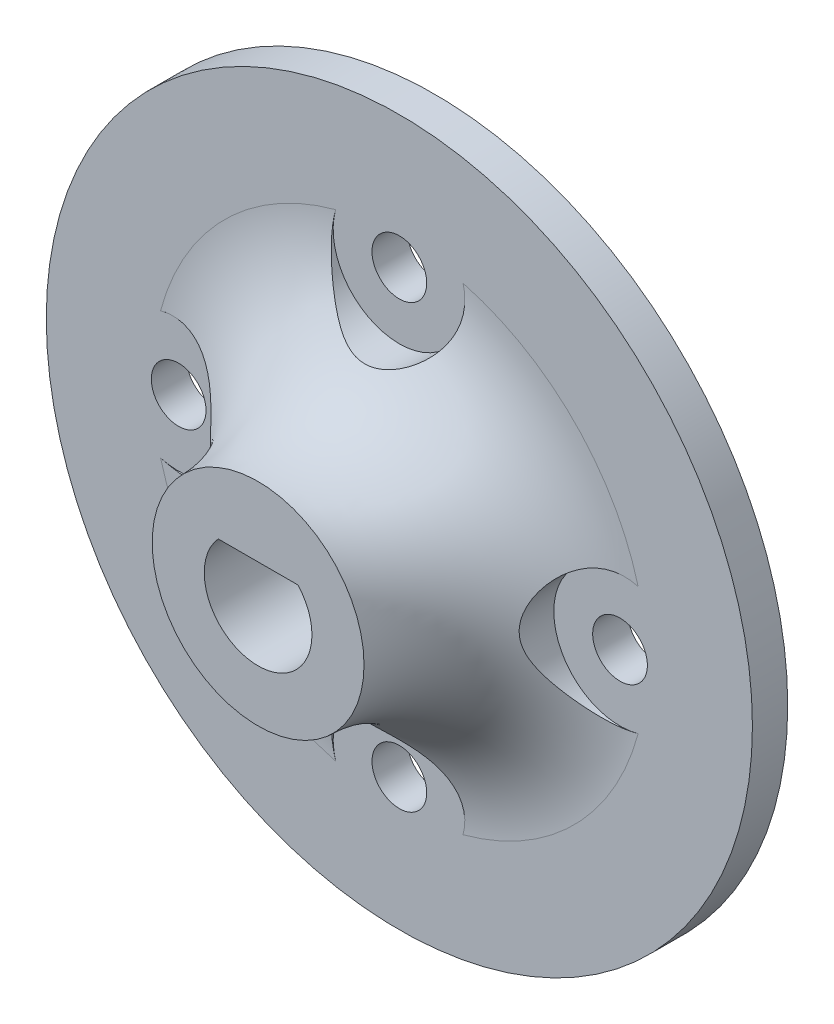
ISO-10303-21;
HEADER;
FILE_DESCRIPTION(('STEP AP214'),'2;1');
FILE_NAME('part.step','',(''),(''),'','','');
FILE_SCHEMA(('AUTOMOTIVE_DESIGN { 1 0 10303 214 1 1 1 1 }'));
ENDSEC;
DATA;
#1=APPLICATION_CONTEXT('core data for automotive mechanical design processes');
#2=APPLICATION_PROTOCOL_DEFINITION('international standard','automotive_design',2000,#1);
#3=PRODUCT_CONTEXT('',#1,'mechanical');
#4=PRODUCT('Part','Part','',(#3));
#5=PRODUCT_RELATED_PRODUCT_CATEGORY('part','',(#4));
#6=PRODUCT_DEFINITION_FORMATION('','',#4);
#7=PRODUCT_DEFINITION_CONTEXT('part definition',#1,'design');
#8=PRODUCT_DEFINITION('design','',#6,#7);
#9=PRODUCT_DEFINITION_SHAPE('','',#8);
#10=(LENGTH_UNIT() NAMED_UNIT(*) SI_UNIT(.MILLI.,.METRE.));
#11=(NAMED_UNIT(*) PLANE_ANGLE_UNIT() SI_UNIT($,.RADIAN.));
#12=(NAMED_UNIT(*) SI_UNIT($,.STERADIAN.) SOLID_ANGLE_UNIT());
#13=UNCERTAINTY_MEASURE_WITH_UNIT(LENGTH_MEASURE(1.E-05),#10,'distance_accuracy_value','');
#14=(GEOMETRIC_REPRESENTATION_CONTEXT(3) GLOBAL_UNCERTAINTY_ASSIGNED_CONTEXT((#13)) GLOBAL_UNIT_ASSIGNED_CONTEXT((#10,
#11,#12)) REPRESENTATION_CONTEXT('',''));
#15=CARTESIAN_POINT('',(0.,0.,0.));
#16=DIRECTION('',(0.,0.,1.));
#17=DIRECTION('',(1.,0.,0.));
#18=AXIS2_PLACEMENT_3D('',#15,#16,#17);
#19=CARTESIAN_POINT('',(0.,0.,10.));
#20=DIRECTION('',(0.,0.,1.));
#21=DIRECTION('',(1.,0.,0.));
#22=AXIS2_PLACEMENT_3D('',#19,#20,#21);
#23=TOROIDAL_SURFACE('',#22,14.,8.);
#24=CARTESIAN_POINT('',(0.,0.,10.));
#25=DIRECTION('',(0.,0.,1.));
#26=DIRECTION('',(1.,0.,0.));
#27=AXIS2_PLACEMENT_3D('',#24,#25,#26);
#28=CIRCLE('',#27,6.);
#29=CARTESIAN_POINT('',(6.,0.,10.));
#30=VERTEX_POINT('',#29);
#31=EDGE_CURVE('E124',#30,#30,#28,.T.);
#32=ORIENTED_EDGE('',*,*,#31,.F.);
#33=EDGE_LOOP('',(#32));
#34=FACE_BOUND('',#33,.T.);
#35=CARTESIAN_POINT('',(3.43684447713288,-14.0002,2.01081690032707));
#36=CARTESIAN_POINT('',(3.47622965574134,-13.9100016291415,2.0067413918557));
#37=CARTESIAN_POINT('',(3.51206268705354,-13.8181961882804,2.00372003774031));
#38=CARTESIAN_POINT('',(3.57641853525506,-13.6319944069215,2.00012284793317));
#39=CARTESIAN_POINT('',(3.60494006368163,-13.5375976130054,1.99954744299853));
#40=CARTESIAN_POINT('',(3.65444428594416,-13.3469020186389,2.00118074818939));
#41=CARTESIAN_POINT('',(3.6754296193078,-13.2506038966138,2.0033884823052));
#42=CARTESIAN_POINT('',(3.70974156269047,-13.0567776899776,2.01088439103382));
#43=CARTESIAN_POINT('',(3.72306883224602,-12.9592497120251,2.01617230029326));
#44=CARTESIAN_POINT('',(3.74202286857625,-12.7635268240614,2.03009383711557));
#45=CARTESIAN_POINT('',(3.74763743096337,-12.6653311035662,2.03873273957132));
#46=CARTESIAN_POINT('',(3.75115693589591,-12.4691421126931,2.05955503987174));
#47=CARTESIAN_POINT('',(3.74905905018469,-12.3711489297717,2.07173973649736));
#48=CARTESIAN_POINT('',(3.73727221363879,-12.1762538638153,2.09976650808929));
#49=CARTESIAN_POINT('',(3.72759173939709,-12.0793508846657,2.1156044851052));
#50=CARTESIAN_POINT('',(3.70087144785875,-11.8872398602149,2.1509857373376));
#51=CARTESIAN_POINT('',(3.68382892116265,-11.7920324523662,2.17053037520097));
#52=CARTESIAN_POINT('',(3.62272738051556,-11.5130311311648,2.23401740208099));
#53=CARTESIAN_POINT('',(3.56847661491014,-11.332551783911,2.28328340768726));
#54=CARTESIAN_POINT('',(3.43552498883541,-10.9852920632796,2.39490953246021));
#55=CARTESIAN_POINT('',(3.35681359768466,-10.8185176292574,2.45727528751866));
#56=CARTESIAN_POINT('',(3.17290482582198,-10.4919160489779,2.59690570162587));
#57=CARTESIAN_POINT('',(3.06639046225075,-10.333123949358,2.67484463280238));
#58=CARTESIAN_POINT('',(2.8331143629192,-10.0359103889414,2.8391656983048));
#59=CARTESIAN_POINT('',(2.70633157683162,-9.89751039728258,2.92555657403251));
#60=CARTESIAN_POINT('',(2.49251413813319,-9.69617762769113,3.06451890009679));
#61=CARTESIAN_POINT('',(2.41134005599085,-9.62607915757269,3.11594458231987));
#62=CARTESIAN_POINT('',(2.24328202034446,-9.49306262890669,3.21886980970001));
#63=CARTESIAN_POINT('',(2.1563966653132,-9.43014634328719,3.27036936993079));
#64=CARTESIAN_POINT('',(1.97706031420376,-9.31169630826483,3.37210879228385));
#65=CARTESIAN_POINT('',(1.88461056565354,-9.25616091296971,3.42234893321442));
#66=CARTESIAN_POINT('',(1.69414695103215,-9.15274701957374,3.51996966532963));
#67=CARTESIAN_POINT('',(1.59613551960995,-9.10486520559324,3.56735148929742));
#68=CARTESIAN_POINT('',(1.35817104509984,-9.00139561558709,3.67355168518201));
#69=CARTESIAN_POINT('',(1.21579044536072,-8.9492102695899,3.73037101146671));
#70=CARTESIAN_POINT('',(0.921145841934333,-8.86166573451981,3.82903129610849));
#71=CARTESIAN_POINT('',(0.768907304441219,-8.82626501293521,3.87090916188897));
#72=CARTESIAN_POINT('',(0.481045408678242,-8.7785858761826,3.92827149888657));
#73=CARTESIAN_POINT('',(0.346514626799823,-8.76356988595109,3.94684537851149));
#74=CARTESIAN_POINT('',(0.0753714746951503,-8.74830537042009,3.96573150549922));
#75=CARTESIAN_POINT('',(-0.0612391665794944,-8.74804518474914,3.96605817222048));
#76=CARTESIAN_POINT('',(-0.332184412521555,-8.76228073223689,3.94843688155529));
#77=CARTESIAN_POINT('',(-0.466522671123034,-8.77674990817597,3.93052181422464));
#78=CARTESIAN_POINT('',(-0.730027180656594,-8.81931406701541,3.87923536788718));
#79=CARTESIAN_POINT('',(-0.859184424236133,-8.84743175365395,3.84583823928411));
#80=CARTESIAN_POINT('',(-1.17372636505531,-8.93304095456952,3.74794487799681));
#81=CARTESIAN_POINT('',(-1.35478157108802,-8.99819247776863,3.67625335469528));
#82=CARTESIAN_POINT('',(-1.61358816350361,-9.11358533641382,3.55878590500707));
#83=CARTESIAN_POINT('',(-1.69784567887928,-9.15507026775512,3.51790549562621));
#84=CARTESIAN_POINT('',(-1.86220697845401,-9.24371582253948,3.43398191091988));
#85=CARTESIAN_POINT('',(-1.94231129561962,-9.29087571514078,3.39093901450221));
#86=CARTESIAN_POINT('',(-2.18351045905287,-9.44511077805266,3.25621656014221));
#87=CARTESIAN_POINT('',(-2.33772288698013,-9.56146744197625,3.16265755481847));
#88=CARTESIAN_POINT('',(-2.62737334369054,-9.81733878300828,2.97819049468635));
#89=CARTESIAN_POINT('',(-2.7628155068428,-9.95684834549721,2.88728185959761));
#90=CARTESIAN_POINT('',(-2.96250060453396,-10.1978568752134,2.7484122760498));
#91=CARTESIAN_POINT('',(-3.0335606610839,-10.2922547534541,2.69781108012052));
#92=CARTESIAN_POINT('',(-3.16727376189561,-10.4887818124712,2.60052223449797));
#93=CARTESIAN_POINT('',(-3.22992565999862,-10.5909120443221,2.55383511867771));
#94=CARTESIAN_POINT('',(-3.34583964384392,-10.802245752481,2.46529308227759));
#95=CARTESIAN_POINT('',(-3.39910876896848,-10.9114438413237,2.4234345472841));
#96=CARTESIAN_POINT('',(-3.49533637328084,-11.1361628607178,2.34520591792595));
#97=CARTESIAN_POINT('',(-3.53829733069029,-11.2516822633228,2.30883450516578));
#98=CARTESIAN_POINT('',(-3.60780168011266,-11.4715738807342,2.24669902669801));
#99=CARTESIAN_POINT('',(-3.63579528864983,-11.5752718789821,2.22016347371697));
#100=CARTESIAN_POINT('',(-3.68292177630668,-11.7857099624693,2.17170642480888));
#101=CARTESIAN_POINT('',(-3.70205580220318,-11.892449652095,2.14978433191999));
#102=CARTESIAN_POINT('',(-3.73104274246915,-12.1080274446772,2.1106058682378));
#103=CARTESIAN_POINT('',(-3.74089615919402,-12.2168654337283,2.09334924494069));
#104=CARTESIAN_POINT('',(-3.75104637857009,-12.4355759274681,2.06341969531537));
#105=CARTESIAN_POINT('',(-3.75134423705898,-12.5454483165193,2.05074626272231));
#106=CARTESIAN_POINT('',(-3.73868711872853,-12.8502711084668,2.02168169902229));
#107=CARTESIAN_POINT('',(-3.71531013316727,-13.0453374246877,2.00998905347929));
#108=CARTESIAN_POINT('',(-3.63827140004638,-13.4293960213548,1.99856033424065));
#109=CARTESIAN_POINT('',(-3.58466638160996,-13.6183989807373,1.99880193681074));
#110=CARTESIAN_POINT('',(-3.50443596382826,-13.8351826546029,2.00457440030235));
#111=CARTESIAN_POINT('',(-3.49156521774794,-13.8684849879762,2.00562114728618));
#112=CARTESIAN_POINT('',(-3.46489885110309,-13.9346574759233,2.00800544883246));
#113=CARTESIAN_POINT('',(-3.45110442880863,-13.9675281267106,2.00934263148605));
#114=CARTESIAN_POINT('',(-3.43684447713323,-14.0002,2.01081690032707));
#115=B_SPLINE_CURVE_WITH_KNOTS('',3,(#35,#36,#37,#38,#39,#40,#41,#42,#43,#44,#45,#46,#47,#48,
#49,#50,#51,#52,#53,#54,#55,#56,#57,#58,#59,#60,#61,#62,#63,#64,#65,#66,#67,#68,#69,#70,#71,#72,
#73,#74,#75,#76,#77,#78,#79,#80,#81,#82,#83,#84,#85,#86,#87,#88,#89,#90,#91,#92,#93,#94,#95,#96,
#97,#98,#99,#100,#101,#102,#103,#104,#105,#106,#107,#108,#109,#110,#111,#112,#113,#114),
.UNSPECIFIED.,.F.,.F.,(4,2,2,2,2,2,2,2,2,2,2,2,2,2,2,2,2,2,2,2,2,2,2,2,2,2,2,2,2,2,2,2,2,2,2,2,
2,2,2,4),(0.,0.295449716099616,0.590951461813274,0.886349607832265,1.18172230942023,
1.47756186479314,1.77350991926028,2.06912760407958,2.36485417560848,2.94639448523544,
3.52818550470397,4.1452670045501,4.7629936053956,5.1195233256441,5.47614086609265,
5.83267874915725,6.18906174264277,6.67335702360782,7.15644760979071,7.56449515736783,
7.97222025202083,8.3792115131083,8.78688211968113,9.39924516430584,9.70635951604001,
10.0134343587348,10.6551884938995,11.2968010498237,11.6819098978748,12.0670711888615,
12.4519422720018,12.8367207340579,13.1681671744635,13.4995707007231,13.8309562872212,
14.1623052572717,14.7497770253132,15.3361499335017,15.4432990827019,15.5503118257288),.UNSPECIFIED.);
#116=CARTESIAN_POINT('',(3.60648634407489,-13.5275000000001,2.));
#117=VERTEX_POINT('',#116);
#118=CARTESIAN_POINT('',(-3.60648634407526,-13.5275,2.));
#119=VERTEX_POINT('',#118);
#120=EDGE_CURVE('E103',#117,#119,#115,.T.);
#121=ORIENTED_EDGE('',*,*,#120,.F.);
#122=CARTESIAN_POINT('',(0.,0.,2.));
#123=DIRECTION('',(0.,0.,1.));
#124=DIRECTION('',(1.,0.,0.));
#125=AXIS2_PLACEMENT_3D('',#122,#123,#124);
#126=CIRCLE('',#125,14.);
#127=CARTESIAN_POINT('',(13.5275,-3.60648634407522,2.));
#128=VERTEX_POINT('',#127);
#129=EDGE_CURVE('E111',#128,#117,#126,.F.);
#130=ORIENTED_EDGE('',*,*,#129,.F.);
#131=CARTESIAN_POINT('',(14.0002,3.43684447713293,2.01081690032707));
#132=CARTESIAN_POINT('',(13.9100016291415,3.47622965574139,2.0067413918557));
#133=CARTESIAN_POINT('',(13.8181961882804,3.51206268705358,2.00372003774031));
#134=CARTESIAN_POINT('',(13.6319944069215,3.5764185352551,2.00012284793317));
#135=CARTESIAN_POINT('',(13.5375976130054,3.60494006368167,1.99954744299853));
#136=CARTESIAN_POINT('',(13.3469020186389,3.65444428594421,2.00118074818939));
#137=CARTESIAN_POINT('',(13.2506038966138,3.67542961930784,2.0033884823052));
#138=CARTESIAN_POINT('',(13.0567776899776,3.70974156269051,2.01088439103381));
#139=CARTESIAN_POINT('',(12.9592497120251,3.72306883224606,2.01617230029326));
#140=CARTESIAN_POINT('',(12.7635268240614,3.74202286857629,2.03009383711557));
#141=CARTESIAN_POINT('',(12.6653311035662,3.74763743096342,2.03873273957132));
#142=CARTESIAN_POINT('',(12.4691421126931,3.75115693589595,2.05955503987173));
#143=CARTESIAN_POINT('',(12.3711489297717,3.74905905018473,2.07173973649736));
#144=CARTESIAN_POINT('',(12.1762538638153,3.73727221363883,2.09976650808929));
#145=CARTESIAN_POINT('',(12.0793508846657,3.72759173939714,2.1156044851052));
#146=CARTESIAN_POINT('',(11.8872398602149,3.7008714478588,2.15098573733759));
#147=CARTESIAN_POINT('',(11.7920324523662,3.68382892116269,2.17053037520097));
#148=CARTESIAN_POINT('',(11.5130311311648,3.62272738051561,2.23401740208099));
#149=CARTESIAN_POINT('',(11.332551783911,3.56847661491019,2.28328340768726));
#150=CARTESIAN_POINT('',(10.9852920632796,3.43552498883546,2.3949095324602));
#151=CARTESIAN_POINT('',(10.8185176292574,3.3568135976847,2.45727528751866));
#152=CARTESIAN_POINT('',(10.4919160489779,3.17290482582202,2.59690570162587));
#153=CARTESIAN_POINT('',(10.333123949358,3.06639046225079,2.67484463280238));
#154=CARTESIAN_POINT('',(10.0359103889414,2.83311436291924,2.8391656983048));
#155=CARTESIAN_POINT('',(9.89751039728258,2.70633157683166,2.92555657403251));
#156=CARTESIAN_POINT('',(9.69617762769113,2.49251413813323,3.06451890009679));
#157=CARTESIAN_POINT('',(9.62607915757269,2.41134005599089,3.11594458231986));
#158=CARTESIAN_POINT('',(9.49306262890669,2.2432820203445,3.2188698097));
#159=CARTESIAN_POINT('',(9.43014634328718,2.15639666531325,3.27036936993079));
#160=CARTESIAN_POINT('',(9.31169630826483,1.9770603142038,3.37210879228385));
#161=CARTESIAN_POINT('',(9.25616091296971,1.88461056565358,3.42234893321441));
#162=CARTESIAN_POINT('',(9.15274701957374,1.69414695103219,3.51996966532963));
#163=CARTESIAN_POINT('',(9.10486520559324,1.59613551961,3.56735148929742));
#164=CARTESIAN_POINT('',(9.00139561558709,1.35817104509989,3.673551685182));
#165=CARTESIAN_POINT('',(8.9492102695899,1.21579044536076,3.73037101146671));
#166=CARTESIAN_POINT('',(8.86166573451981,0.921145841934375,3.82903129610848));
#167=CARTESIAN_POINT('',(8.82626501293521,0.768907304441261,3.87090916188897));
#168=CARTESIAN_POINT('',(8.7785858761826,0.481045408678284,3.92827149888657));
#169=CARTESIAN_POINT('',(8.76356988595109,0.346514626799866,3.94684537851149));
#170=CARTESIAN_POINT('',(8.74830537042009,0.075371474695193,3.96573150549922));
#171=CARTESIAN_POINT('',(8.74804518474914,-0.0612391665794519,3.96605817222048));
#172=CARTESIAN_POINT('',(8.76228073223689,-0.332184412521513,3.94843688155529));
#173=CARTESIAN_POINT('',(8.77674990817597,-0.466522671122992,3.93052181422464));
#174=CARTESIAN_POINT('',(8.81931406701542,-0.730027180656551,3.87923536788719));
#175=CARTESIAN_POINT('',(8.84743175365395,-0.859184424236091,3.84583823928412));
#176=CARTESIAN_POINT('',(8.93304095456952,-1.17372636505527,3.74794487799681));
#177=CARTESIAN_POINT('',(8.99819247776863,-1.35478157108798,3.67625335469528));
#178=CARTESIAN_POINT('',(9.11358533641382,-1.61358816350357,3.55878590500708));
#179=CARTESIAN_POINT('',(9.15507026775512,-1.69784567887923,3.51790549562622));
#180=CARTESIAN_POINT('',(9.24371582253948,-1.86220697845396,3.43398191091989));
#181=CARTESIAN_POINT('',(9.29087571514078,-1.94231129561957,3.39093901450221));
#182=CARTESIAN_POINT('',(9.44511077805266,-2.18351045905282,3.25621656014221));
#183=CARTESIAN_POINT('',(9.56146744197624,-2.33772288698008,3.16265755481847));
#184=CARTESIAN_POINT('',(9.81733878300828,-2.62737334369049,2.97819049468636));
#185=CARTESIAN_POINT('',(9.95684834549721,-2.76281550684275,2.88728185959762));
#186=CARTESIAN_POINT('',(10.1978568752134,-2.96250060453391,2.74841227604981));
#187=CARTESIAN_POINT('',(10.2922547534541,-3.03356066108385,2.69781108012053));
#188=CARTESIAN_POINT('',(10.4887818124712,-3.16727376189556,2.60052223449797));
#189=CARTESIAN_POINT('',(10.5909120443221,-3.22992565999857,2.55383511867772));
#190=CARTESIAN_POINT('',(10.802245752481,-3.34583964384387,2.4652930822776));
#191=CARTESIAN_POINT('',(10.9114438413237,-3.39910876896844,2.42343454728411));
#192=CARTESIAN_POINT('',(11.1361628607178,-3.4953363732808,2.34520591792595));
#193=CARTESIAN_POINT('',(11.2516822633228,-3.53829733069025,2.30883450516579));
#194=CARTESIAN_POINT('',(11.4715738807342,-3.60780168011262,2.24669902669802));
#195=CARTESIAN_POINT('',(11.5752718789821,-3.63579528864978,2.22016347371697));
#196=CARTESIAN_POINT('',(11.7857099624693,-3.68292177630663,2.17170642480888));
#197=CARTESIAN_POINT('',(11.892449652095,-3.70205580220313,2.14978433191999));
#198=CARTESIAN_POINT('',(12.1080274446772,-3.73104274246911,2.1106058682378));
#199=CARTESIAN_POINT('',(12.2168654337283,-3.74089615919397,2.09334924494069));
#200=CARTESIAN_POINT('',(12.4355759274681,-3.75104637857004,2.06341969531538));
#201=CARTESIAN_POINT('',(12.5454483165193,-3.75134423705894,2.05074626272231));
#202=CARTESIAN_POINT('',(12.8502711084668,-3.73868711872849,2.02168169902229));
#203=CARTESIAN_POINT('',(13.0453374246877,-3.71531013316723,2.00998905347929));
#204=CARTESIAN_POINT('',(13.4293960213548,-3.63827140004634,1.99856033424065));
#205=CARTESIAN_POINT('',(13.6183989807373,-3.58466638160992,1.99880193681074));
#206=CARTESIAN_POINT('',(13.8351826546029,-3.50443596382821,2.00457440030235));
#207=CARTESIAN_POINT('',(13.8684849879762,-3.49156521774789,2.00562114728618));
#208=CARTESIAN_POINT('',(13.9346574759233,-3.46489885110305,2.00800544883246));
#209=CARTESIAN_POINT('',(13.9675281267106,-3.45110442880859,2.00934263148605));
#210=CARTESIAN_POINT('',(14.0002,-3.43684447713319,2.01081690032707));
#211=B_SPLINE_CURVE_WITH_KNOTS('',3,(#131,#132,#133,#134,#135,#136,#137,#138,#139,#140,#141,
#142,#143,#144,#145,#146,#147,#148,#149,#150,#151,#152,#153,#154,#155,#156,#157,#158,#159,#160,
#161,#162,#163,#164,#165,#166,#167,#168,#169,#170,#171,#172,#173,#174,#175,#176,#177,#178,#179,
#180,#181,#182,#183,#184,#185,#186,#187,#188,#189,#190,#191,#192,#193,#194,#195,#196,#197,#198,
#199,#200,#201,#202,#203,#204,#205,#206,#207,#208,#209,#210),.UNSPECIFIED.,.F.,.F.,(4,2,2,2,2,2,
2,2,2,2,2,2,2,2,2,2,2,2,2,2,2,2,2,2,2,2,2,2,2,2,2,2,2,2,2,2,2,2,2,4),(0.,0.295449716099616,
0.590951461813275,0.886349607832269,1.18172230942023,1.47756186479314,1.77350991926028,
2.06912760407959,2.36485417560849,2.94639448523544,3.52818550470398,4.1452670045501,
4.7629936053956,5.1195233256441,5.47614086609265,5.83267874915725,6.18906174264277,
6.67335702360782,7.15644760979072,7.56449515736784,7.97222025202084,8.3792115131083,
8.78688211968114,9.39924516430583,9.70635951604001,10.0134343587348,10.6551884938995,
11.2968010498237,11.6819098978748,12.0670711888615,12.4519422720018,12.8367207340579,
13.1681671744635,13.4995707007231,13.8309562872212,14.1623052572717,14.7497770253132,
15.3361499335017,15.4432990827019,15.5503118257288),.UNSPECIFIED.);
#212=CARTESIAN_POINT('',(13.5275,3.60648634407493,2.));
#213=VERTEX_POINT('',#212);
#214=EDGE_CURVE('E11',#213,#128,#211,.T.);
#215=ORIENTED_EDGE('',*,*,#214,.F.);
#216=CARTESIAN_POINT('',(3.60648634407536,13.5274999999999,2.));
#217=VERTEX_POINT('',#216);
#218=EDGE_CURVE('E110',#217,#213,#126,.F.);
#219=ORIENTED_EDGE('',*,*,#218,.F.);
#220=CARTESIAN_POINT('',(-3.4368444771328,14.0002,2.01081690032706));
#221=CARTESIAN_POINT('',(-3.47622965574125,13.9100016291415,2.0067413918557));
#222=CARTESIAN_POINT('',(-3.51206268705345,13.8181961882804,2.0037200377403));
#223=CARTESIAN_POINT('',(-3.57641853525497,13.6319944069215,2.00012284793317));
#224=CARTESIAN_POINT('',(-3.60494006368154,13.5375976130054,1.99954744299853));
#225=CARTESIAN_POINT('',(-3.65444428594407,13.3469020186389,2.0011807481894));
#226=CARTESIAN_POINT('',(-3.67542961930771,13.2506038966138,2.0033884823052));
#227=CARTESIAN_POINT('',(-3.70974156269038,13.0567776899776,2.01088439103382));
#228=CARTESIAN_POINT('',(-3.72306883224593,12.9592497120251,2.01617230029326));
#229=CARTESIAN_POINT('',(-3.74202286857616,12.7635268240614,2.03009383711557));
#230=CARTESIAN_POINT('',(-3.74763743096329,12.6653311035662,2.03873273957132));
#231=CARTESIAN_POINT('',(-3.75115693589582,12.4691421126931,2.05955503987174));
#232=CARTESIAN_POINT('',(-3.7490590501846,12.3711489297717,2.07173973649736));
#233=CARTESIAN_POINT('',(-3.7372722136387,12.1762538638153,2.09976650808929));
#234=CARTESIAN_POINT('',(-3.72759173939701,12.0793508846657,2.1156044851052));
#235=CARTESIAN_POINT('',(-3.70087144785867,11.8872398602149,2.1509857373376));
#236=CARTESIAN_POINT('',(-3.68382892116256,11.7920324523662,2.17053037520097));
#237=CARTESIAN_POINT('',(-3.62272738051548,11.5130311311648,2.234017402081));
#238=CARTESIAN_POINT('',(-3.56847661491006,11.332551783911,2.28328340768727));
#239=CARTESIAN_POINT('',(-3.43552498883533,10.9852920632796,2.39490953246021));
#240=CARTESIAN_POINT('',(-3.35681359768457,10.8185176292574,2.45727528751867));
#241=CARTESIAN_POINT('',(-3.17290482582189,10.4919160489779,2.59690570162588));
#242=CARTESIAN_POINT('',(-3.06639046225066,10.333123949358,2.67484463280239));
#243=CARTESIAN_POINT('',(-2.83311436291911,10.0359103889414,2.83916569830481));
#244=CARTESIAN_POINT('',(-2.70633157683154,9.89751039728258,2.92555657403253));
#245=CARTESIAN_POINT('',(-2.4925141381331,9.69617762769113,3.0645189000968));
#246=CARTESIAN_POINT('',(-2.41134005599076,9.62607915757269,3.11594458231988));
#247=CARTESIAN_POINT('',(-2.24328202034437,9.49306262890669,3.21886980970002));
#248=CARTESIAN_POINT('',(-2.15639666531312,9.43014634328719,3.27036936993081));
#249=CARTESIAN_POINT('',(-1.97706031420367,9.31169630826483,3.37210879228387));
#250=CARTESIAN_POINT('',(-1.88461056565345,9.25616091296971,3.42234893321443));
#251=CARTESIAN_POINT('',(-1.69414695103206,9.15274701957374,3.51996966532964));
#252=CARTESIAN_POINT('',(-1.59613551960986,9.10486520559324,3.56735148929743));
#253=CARTESIAN_POINT('',(-1.35817104509975,9.00139561558709,3.67355168518202));
#254=CARTESIAN_POINT('',(-1.21579044536063,8.9492102695899,3.73037101146672));
#255=CARTESIAN_POINT('',(-0.921145841934246,8.86166573451981,3.8290312961085));
#256=CARTESIAN_POINT('',(-0.768907304441134,8.82626501293521,3.87090916188898));
#257=CARTESIAN_POINT('',(-0.481045408678158,8.7785858761826,3.92827149888658));
#258=CARTESIAN_POINT('',(-0.34651462679974,8.76356988595109,3.94684537851149));
#259=CARTESIAN_POINT('',(-0.0753714746950673,8.74830537042009,3.96573150549922));
#260=CARTESIAN_POINT('',(0.0612391665795771,8.74804518474914,3.96605817222048));
#261=CARTESIAN_POINT('',(0.332184412521638,8.76228073223689,3.94843688155529));
#262=CARTESIAN_POINT('',(0.466522671123116,8.77674990817597,3.93052181422464));
#263=CARTESIAN_POINT('',(0.730027180656675,8.81931406701541,3.87923536788718));
#264=CARTESIAN_POINT('',(0.859184424236214,8.84743175365395,3.84583823928411));
#265=CARTESIAN_POINT('',(1.17372636505539,8.93304095456952,3.7479448779968));
#266=CARTESIAN_POINT('',(1.35478157108811,8.99819247776863,3.67625335469527));
#267=CARTESIAN_POINT('',(1.61358816350369,9.11358533641382,3.55878590500706));
#268=CARTESIAN_POINT('',(1.69784567887936,9.15507026775512,3.5179054956262));
#269=CARTESIAN_POINT('',(1.86220697845409,9.24371582253948,3.43398191091987));
#270=CARTESIAN_POINT('',(1.9423112956197,9.29087571514078,3.39093901450219));
#271=CARTESIAN_POINT('',(2.18351045905296,9.44511077805266,3.25621656014219));
#272=CARTESIAN_POINT('',(2.33772288698021,9.56146744197625,3.16265755481845));
#273=CARTESIAN_POINT('',(2.62737334369063,9.81733878300829,2.97819049468633));
#274=CARTESIAN_POINT('',(2.7628155068429,9.95684834549722,2.8872818595976));
#275=CARTESIAN_POINT('',(2.96250060453405,10.1978568752134,2.74841227604978));
#276=CARTESIAN_POINT('',(3.03356066108399,10.2922547534541,2.6978110801205));
#277=CARTESIAN_POINT('',(3.1672737618957,10.4887818124712,2.60052223449795));
#278=CARTESIAN_POINT('',(3.22992565999871,10.5909120443221,2.55383511867769));
#279=CARTESIAN_POINT('',(3.34583964384401,10.802245752481,2.46529308227758));
#280=CARTESIAN_POINT('',(3.39910876896858,10.9114438413237,2.42343454728409));
#281=CARTESIAN_POINT('',(3.49533637328094,11.1361628607178,2.34520591792594));
#282=CARTESIAN_POINT('',(3.53829733069038,11.2516822633228,2.30883450516577));
#283=CARTESIAN_POINT('',(3.60780168011275,11.4715738807342,2.246699026698));
#284=CARTESIAN_POINT('',(3.63579528864992,11.5752718789821,2.22016347371696));
#285=CARTESIAN_POINT('',(3.68292177630677,11.7857099624693,2.17170642480887));
#286=CARTESIAN_POINT('',(3.70205580220327,11.892449652095,2.14978433191998));
#287=CARTESIAN_POINT('',(3.73104274246924,12.1080274446772,2.11060586823779));
#288=CARTESIAN_POINT('',(3.74089615919411,12.2168654337283,2.09334924494068));
#289=CARTESIAN_POINT('',(3.75104637857017,12.4355759274681,2.06341969531537));
#290=CARTESIAN_POINT('',(3.75134423705907,12.5454483165193,2.0507462627223));
#291=CARTESIAN_POINT('',(3.73868711872862,12.8502711084668,2.02168169902228));
#292=CARTESIAN_POINT('',(3.71531013316736,13.0453374246877,2.00998905347928));
#293=CARTESIAN_POINT('',(3.63827140004647,13.4293960213548,1.99856033424065));
#294=CARTESIAN_POINT('',(3.58466638161004,13.6183989807374,1.99880193681074));
#295=CARTESIAN_POINT('',(3.50443596382834,13.8351826546029,2.00457440030235));
#296=CARTESIAN_POINT('',(3.49156521774802,13.8684849879762,2.00562114728618));
#297=CARTESIAN_POINT('',(3.46489885110318,13.9346574759233,2.00800544883246));
#298=CARTESIAN_POINT('',(3.45110442880872,13.9675281267106,2.00934263148605));
#299=CARTESIAN_POINT('',(3.43684447713332,14.0002,2.01081690032707));
#300=B_SPLINE_CURVE_WITH_KNOTS('',3,(#220,#221,#222,#223,#224,#225,#226,#227,#228,#229,#230,
#231,#232,#233,#234,#235,#236,#237,#238,#239,#240,#241,#242,#243,#244,#245,#246,#247,#248,#249,
#250,#251,#252,#253,#254,#255,#256,#257,#258,#259,#260,#261,#262,#263,#264,#265,#266,#267,#268,
#269,#270,#271,#272,#273,#274,#275,#276,#277,#278,#279,#280,#281,#282,#283,#284,#285,#286,#287,
#288,#289,#290,#291,#292,#293,#294,#295,#296,#297,#298,#299),.UNSPECIFIED.,.F.,.F.,(4,2,2,2,2,2,
2,2,2,2,2,2,2,2,2,2,2,2,2,2,2,2,2,2,2,2,2,2,2,2,2,2,2,2,2,2,2,2,2,4),(0.,0.295449716099616,
0.590951461813272,0.886349607832265,1.18172230942023,1.47756186479314,1.77350991926028,
2.06912760407959,2.36485417560848,2.94639448523544,3.52818550470397,4.1452670045501,
4.7629936053956,5.1195233256441,5.47614086609265,5.83267874915725,6.18906174264278,
6.67335702360782,7.15644760979071,7.56449515736783,7.97222025202083,8.37921151310829,
8.78688211968113,9.39924516430583,9.70635951604,10.0134343587348,10.6551884938995,
11.2968010498237,11.6819098978748,12.0670711888615,12.4519422720018,12.8367207340579,
13.1681671744635,13.4995707007231,13.8309562872212,14.1623052572717,14.7497770253132,
15.3361499335017,15.4432990827019,15.5503118257288),.UNSPECIFIED.);
#301=CARTESIAN_POINT('',(-3.60648634407479,13.5275000000001,2.));
#302=VERTEX_POINT('',#301);
#303=EDGE_CURVE('E104',#302,#217,#300,.T.);
#304=ORIENTED_EDGE('',*,*,#303,.F.);
#305=CARTESIAN_POINT('',(-13.5275,3.60648634407522,2.));
#306=VERTEX_POINT('',#305);
#307=EDGE_CURVE('E102',#306,#302,#126,.F.);
#308=ORIENTED_EDGE('',*,*,#307,.F.);
#309=CARTESIAN_POINT('',(-14.0002,-3.43684447713293,2.01081690032707));
#310=CARTESIAN_POINT('',(-13.9100016291415,-3.47622965574139,2.0067413918557));
#311=CARTESIAN_POINT('',(-13.8181961882804,-3.51206268705358,2.00372003774031));
#312=CARTESIAN_POINT('',(-13.6319944069215,-3.5764185352551,2.00012284793317));
#313=CARTESIAN_POINT('',(-13.5375976130054,-3.60494006368167,1.99954744299853));
#314=CARTESIAN_POINT('',(-13.3469020186389,-3.65444428594421,2.00118074818939));
#315=CARTESIAN_POINT('',(-13.2506038966138,-3.67542961930784,2.0033884823052));
#316=CARTESIAN_POINT('',(-13.0567776899776,-3.70974156269051,2.01088439103381));
#317=CARTESIAN_POINT('',(-12.9592497120251,-3.72306883224606,2.01617230029326));
#318=CARTESIAN_POINT('',(-12.7635268240614,-3.74202286857629,2.03009383711557));
#319=CARTESIAN_POINT('',(-12.6653311035662,-3.74763743096342,2.03873273957132));
#320=CARTESIAN_POINT('',(-12.4691421126931,-3.75115693589595,2.05955503987173));
#321=CARTESIAN_POINT('',(-12.3711489297717,-3.74905905018473,2.07173973649736));
#322=CARTESIAN_POINT('',(-12.1762538638153,-3.73727221363883,2.09976650808929));
#323=CARTESIAN_POINT('',(-12.0793508846657,-3.72759173939714,2.1156044851052));
#324=CARTESIAN_POINT('',(-11.8872398602149,-3.7008714478588,2.15098573733759));
#325=CARTESIAN_POINT('',(-11.7920324523662,-3.68382892116269,2.17053037520097));
#326=CARTESIAN_POINT('',(-11.5130311311648,-3.62272738051561,2.23401740208099));
#327=CARTESIAN_POINT('',(-11.332551783911,-3.56847661491019,2.28328340768726));
#328=CARTESIAN_POINT('',(-10.9852920632796,-3.43552498883546,2.3949095324602));
#329=CARTESIAN_POINT('',(-10.8185176292574,-3.3568135976847,2.45727528751866));
#330=CARTESIAN_POINT('',(-10.4919160489779,-3.17290482582202,2.59690570162587));
#331=CARTESIAN_POINT('',(-10.333123949358,-3.06639046225079,2.67484463280238));
#332=CARTESIAN_POINT('',(-10.0359103889414,-2.83311436291924,2.8391656983048));
#333=CARTESIAN_POINT('',(-9.89751039728258,-2.70633157683166,2.92555657403251));
#334=CARTESIAN_POINT('',(-9.69617762769113,-2.49251413813323,3.06451890009679));
#335=CARTESIAN_POINT('',(-9.62607915757269,-2.41134005599089,3.11594458231986));
#336=CARTESIAN_POINT('',(-9.49306262890669,-2.2432820203445,3.2188698097));
#337=CARTESIAN_POINT('',(-9.43014634328718,-2.15639666531325,3.27036936993079));
#338=CARTESIAN_POINT('',(-9.31169630826483,-1.9770603142038,3.37210879228385));
#339=CARTESIAN_POINT('',(-9.25616091296971,-1.88461056565358,3.42234893321441));
#340=CARTESIAN_POINT('',(-9.15274701957374,-1.69414695103219,3.51996966532963));
#341=CARTESIAN_POINT('',(-9.10486520559324,-1.59613551961,3.56735148929742));
#342=CARTESIAN_POINT('',(-9.00139561558709,-1.35817104509989,3.673551685182));
#343=CARTESIAN_POINT('',(-8.9492102695899,-1.21579044536076,3.73037101146671));
#344=CARTESIAN_POINT('',(-8.86166573451981,-0.921145841934375,3.82903129610848));
#345=CARTESIAN_POINT('',(-8.82626501293521,-0.768907304441261,3.87090916188897));
#346=CARTESIAN_POINT('',(-8.7785858761826,-0.481045408678284,3.92827149888657));
#347=CARTESIAN_POINT('',(-8.76356988595109,-0.346514626799866,3.94684537851149));
#348=CARTESIAN_POINT('',(-8.74830537042009,-0.075371474695193,3.96573150549922));
#349=CARTESIAN_POINT('',(-8.74804518474914,0.0612391665794519,3.96605817222048));
#350=CARTESIAN_POINT('',(-8.76228073223689,0.332184412521513,3.94843688155529));
#351=CARTESIAN_POINT('',(-8.77674990817597,0.466522671122992,3.93052181422464));
#352=CARTESIAN_POINT('',(-8.81931406701542,0.730027180656551,3.87923536788719));
#353=CARTESIAN_POINT('',(-8.84743175365395,0.859184424236091,3.84583823928412));
#354=CARTESIAN_POINT('',(-8.93304095456952,1.17372636505527,3.74794487799681));
#355=CARTESIAN_POINT('',(-8.99819247776863,1.35478157108798,3.67625335469528));
#356=CARTESIAN_POINT('',(-9.11358533641382,1.61358816350357,3.55878590500708));
#357=CARTESIAN_POINT('',(-9.15507026775512,1.69784567887923,3.51790549562622));
#358=CARTESIAN_POINT('',(-9.24371582253948,1.86220697845396,3.43398191091989));
#359=CARTESIAN_POINT('',(-9.29087571514078,1.94231129561957,3.39093901450221));
#360=CARTESIAN_POINT('',(-9.44511077805266,2.18351045905282,3.25621656014221));
#361=CARTESIAN_POINT('',(-9.56146744197624,2.33772288698008,3.16265755481847));
#362=CARTESIAN_POINT('',(-9.81733878300828,2.62737334369049,2.97819049468636));
#363=CARTESIAN_POINT('',(-9.95684834549721,2.76281550684275,2.88728185959762));
#364=CARTESIAN_POINT('',(-10.1978568752134,2.96250060453391,2.74841227604981));
#365=CARTESIAN_POINT('',(-10.2922547534541,3.03356066108385,2.69781108012053));
#366=CARTESIAN_POINT('',(-10.4887818124712,3.16727376189556,2.60052223449797));
#367=CARTESIAN_POINT('',(-10.5909120443221,3.22992565999857,2.55383511867772));
#368=CARTESIAN_POINT('',(-10.802245752481,3.34583964384387,2.4652930822776));
#369=CARTESIAN_POINT('',(-10.9114438413237,3.39910876896844,2.42343454728411));
#370=CARTESIAN_POINT('',(-11.1361628607178,3.4953363732808,2.34520591792595));
#371=CARTESIAN_POINT('',(-11.2516822633228,3.53829733069025,2.30883450516579));
#372=CARTESIAN_POINT('',(-11.4715738807342,3.60780168011262,2.24669902669802));
#373=CARTESIAN_POINT('',(-11.5752718789821,3.63579528864978,2.22016347371697));
#374=CARTESIAN_POINT('',(-11.7857099624693,3.68292177630663,2.17170642480888));
#375=CARTESIAN_POINT('',(-11.892449652095,3.70205580220313,2.14978433191999));
#376=CARTESIAN_POINT('',(-12.1080274446772,3.73104274246911,2.1106058682378));
#377=CARTESIAN_POINT('',(-12.2168654337283,3.74089615919397,2.09334924494069));
#378=CARTESIAN_POINT('',(-12.4355759274681,3.75104637857004,2.06341969531538));
#379=CARTESIAN_POINT('',(-12.5454483165193,3.75134423705894,2.05074626272231));
#380=CARTESIAN_POINT('',(-12.8502711084668,3.73868711872849,2.02168169902229));
#381=CARTESIAN_POINT('',(-13.0453374246877,3.71531013316723,2.00998905347929));
#382=CARTESIAN_POINT('',(-13.4293960213548,3.63827140004634,1.99856033424065));
#383=CARTESIAN_POINT('',(-13.6183989807373,3.58466638160992,1.99880193681074));
#384=CARTESIAN_POINT('',(-13.8351826546029,3.50443596382821,2.00457440030235));
#385=CARTESIAN_POINT('',(-13.8684849879762,3.49156521774789,2.00562114728618));
#386=CARTESIAN_POINT('',(-13.9346574759233,3.46489885110305,2.00800544883246));
#387=CARTESIAN_POINT('',(-13.9675281267106,3.45110442880859,2.00934263148605));
#388=CARTESIAN_POINT('',(-14.0002,3.43684447713319,2.01081690032707));
#389=B_SPLINE_CURVE_WITH_KNOTS('',3,(#309,#310,#311,#312,#313,#314,#315,#316,#317,#318,#319,
#320,#321,#322,#323,#324,#325,#326,#327,#328,#329,#330,#331,#332,#333,#334,#335,#336,#337,#338,
#339,#340,#341,#342,#343,#344,#345,#346,#347,#348,#349,#350,#351,#352,#353,#354,#355,#356,#357,
#358,#359,#360,#361,#362,#363,#364,#365,#366,#367,#368,#369,#370,#371,#372,#373,#374,#375,#376,
#377,#378,#379,#380,#381,#382,#383,#384,#385,#386,#387,#388),.UNSPECIFIED.,.F.,.F.,(4,2,2,2,2,2,
2,2,2,2,2,2,2,2,2,2,2,2,2,2,2,2,2,2,2,2,2,2,2,2,2,2,2,2,2,2,2,2,2,4),(0.,0.295449716099616,
0.590951461813275,0.886349607832269,1.18172230942023,1.47756186479314,1.77350991926028,
2.06912760407959,2.36485417560849,2.94639448523544,3.52818550470398,4.1452670045501,
4.7629936053956,5.1195233256441,5.47614086609265,5.83267874915725,6.18906174264277,
6.67335702360782,7.15644760979072,7.56449515736784,7.97222025202084,8.3792115131083,
8.78688211968114,9.39924516430583,9.70635951604001,10.0134343587348,10.6551884938995,
11.2968010498237,11.6819098978748,12.0670711888615,12.4519422720018,12.8367207340579,
13.1681671744635,13.4995707007231,13.8309562872212,14.1623052572717,14.7497770253132,
15.3361499335017,15.4432990827019,15.5503118257288),.UNSPECIFIED.);
#390=CARTESIAN_POINT('',(-13.5275,-3.60648634407493,2.));
#391=VERTEX_POINT('',#390);
#392=EDGE_CURVE('E90',#391,#306,#389,.T.);
#393=ORIENTED_EDGE('',*,*,#392,.F.);
#394=EDGE_CURVE('E44',#119,#391,#126,.F.);
#395=ORIENTED_EDGE('',*,*,#394,.F.);
#396=EDGE_LOOP('',(#121,#130,#215,#219,#304,#308,#393,#395));
#397=FACE_BOUND('',#396,.T.);
#398=ADVANCED_FACE('F32',(#34,#397),#23,.F.);
#399=CARTESIAN_POINT('',(0.,0.,2.));
#400=DIRECTION('',(0.,0.,1.));
#401=DIRECTION('',(1.,0.,0.));
#402=AXIS2_PLACEMENT_3D('',#399,#400,#401);
#403=PLANE('',#402);
#404=CARTESIAN_POINT('',(0.,-12.5,2.));
#405=DIRECTION('',(0.,0.,1.));
#406=DIRECTION('',(1.,0.,0.));
#407=AXIS2_PLACEMENT_3D('',#404,#405,#406);
#408=CIRCLE('',#407,1.55);
#409=CARTESIAN_POINT('',(1.55,-12.5,2.));
#410=VERTEX_POINT('',#409);
#411=EDGE_CURVE('E140',#410,#410,#408,.T.);
#412=ORIENTED_EDGE('',*,*,#411,.F.);
#413=EDGE_LOOP('',(#412));
#414=FACE_BOUND('',#413,.T.);
#415=CARTESIAN_POINT('',(-12.5,0.,2.));
#416=DIRECTION('',(0.,0.,1.));
#417=DIRECTION('',(0.,-1.,0.));
#418=AXIS2_PLACEMENT_3D('',#415,#416,#417);
#419=CIRCLE('',#418,1.55);
#420=CARTESIAN_POINT('',(-12.5,-1.54999999999996,2.));
#421=VERTEX_POINT('',#420);
#422=EDGE_CURVE('E159',#421,#421,#419,.T.);
#423=ORIENTED_EDGE('',*,*,#422,.F.);
#424=EDGE_LOOP('',(#423));
#425=FACE_BOUND('',#424,.T.);
#426=CARTESIAN_POINT('',(0.,12.5,2.));
#427=DIRECTION('',(0.,0.,1.));
#428=DIRECTION('',(-1.,0.,0.));
#429=AXIS2_PLACEMENT_3D('',#426,#427,#428);
#430=CIRCLE('',#429,1.55);
#431=CARTESIAN_POINT('',(-1.55,12.5,2.));
#432=VERTEX_POINT('',#431);
#433=EDGE_CURVE('E153',#432,#432,#430,.T.);
#434=ORIENTED_EDGE('',*,*,#433,.F.);
#435=EDGE_LOOP('',(#434));
#436=FACE_BOUND('',#435,.T.);
#437=ORIENTED_EDGE('',*,*,#129,.T.);
#438=CARTESIAN_POINT('',(-1.74574066942157E-13,-12.5,2.));
#439=DIRECTION('',(0.,0.,1.));
#440=DIRECTION('',(0.,-1.,0.));
#441=AXIS2_PLACEMENT_3D('',#438,#439,#440);
#442=CIRCLE('',#441,3.75);
#443=EDGE_CURVE('E95',#117,#119,#442,.T.);
#444=ORIENTED_EDGE('',*,*,#443,.T.);
#445=ORIENTED_EDGE('',*,*,#394,.T.);
#446=CARTESIAN_POINT('',(-12.5,1.30930550206618E-13,2.));
#447=DIRECTION('',(0.,0.,1.));
#448=DIRECTION('',(-1.,0.,0.));
#449=AXIS2_PLACEMENT_3D('',#446,#447,#448);
#450=CIRCLE('',#449,3.75);
#451=EDGE_CURVE('E87',#391,#306,#450,.T.);
#452=ORIENTED_EDGE('',*,*,#451,.T.);
#453=ORIENTED_EDGE('',*,*,#307,.T.);
#454=CARTESIAN_POINT('',(2.61861100413235E-13,12.5,2.));
#455=DIRECTION('',(0.,0.,1.));
#456=DIRECTION('',(0.,1.,0.));
#457=AXIS2_PLACEMENT_3D('',#454,#455,#456);
#458=CIRCLE('',#457,3.75);
#459=EDGE_CURVE('E96',#302,#217,#458,.T.);
#460=ORIENTED_EDGE('',*,*,#459,.T.);
#461=ORIENTED_EDGE('',*,*,#218,.T.);
#462=CARTESIAN_POINT('',(12.5,-1.30930550206618E-13,2.));
#463=DIRECTION('',(0.,0.,1.));
#464=DIRECTION('',(1.,0.,0.));
#465=AXIS2_PLACEMENT_3D('',#462,#463,#464);
#466=CIRCLE('',#465,3.75);
#467=EDGE_CURVE('E150',#213,#128,#466,.T.);
#468=ORIENTED_EDGE('',*,*,#467,.T.);
#469=EDGE_LOOP('',(#437,#444,#445,#452,#453,#460,#461,#468));
#470=FACE_BOUND('',#469,.T.);
#471=CARTESIAN_POINT('',(0.,0.,2.));
#472=DIRECTION('',(0.,0.,1.));
#473=DIRECTION('',(1.,0.,0.));
#474=AXIS2_PLACEMENT_3D('',#471,#472,#473);
#475=CIRCLE('',#474,20.);
#476=CARTESIAN_POINT('',(20.,0.,2.));
#477=VERTEX_POINT('',#476);
#478=EDGE_CURVE('E117',#477,#477,#475,.T.);
#479=ORIENTED_EDGE('',*,*,#478,.T.);
#480=EDGE_LOOP('',(#479));
#481=FACE_BOUND('',#480,.T.);
#482=CARTESIAN_POINT('',(12.5,-1.30930550206618E-13,2.));
#483=DIRECTION('',(0.,0.,1.));
#484=DIRECTION('',(0.,1.,0.));
#485=AXIS2_PLACEMENT_3D('',#482,#483,#484);
#486=CIRCLE('',#485,1.55);
#487=CARTESIAN_POINT('',(12.5,1.54999999999987,2.));
#488=VERTEX_POINT('',#487);
#489=EDGE_CURVE('E146',#488,#488,#486,.T.);
#490=ORIENTED_EDGE('',*,*,#489,.F.);
#491=EDGE_LOOP('',(#490));
#492=FACE_BOUND('',#491,.T.);
#493=ADVANCED_FACE('F108',(#414,#425,#436,#470,#481,#492),#403,.T.);
#494=CARTESIAN_POINT('',(0.,0.,2.));
#495=DIRECTION('',(0.,0.,-1.));
#496=DIRECTION('',(-1.,0.,0.));
#497=AXIS2_PLACEMENT_3D('',#494,#495,#496);
#498=CYLINDRICAL_SURFACE('',#497,20.);
#499=ORIENTED_EDGE('',*,*,#478,.F.);
#500=EDGE_LOOP('',(#499));
#501=FACE_BOUND('',#500,.T.);
#502=CARTESIAN_POINT('',(0.,0.,0.));
#503=DIRECTION('',(0.,0.,1.));
#504=DIRECTION('',(1.,0.,0.));
#505=AXIS2_PLACEMENT_3D('',#502,#503,#504);
#506=CIRCLE('',#505,20.);
#507=CARTESIAN_POINT('',(20.,0.,0.));
#508=VERTEX_POINT('',#507);
#509=EDGE_CURVE('E120',#508,#508,#506,.T.);
#510=ORIENTED_EDGE('',*,*,#509,.T.);
#511=EDGE_LOOP('',(#510));
#512=FACE_BOUND('',#511,.T.);
#513=ADVANCED_FACE('F207',(#501,#512),#498,.T.);
#514=CARTESIAN_POINT('',(0.,0.,0.));
#515=DIRECTION('',(0.,0.,1.));
#516=DIRECTION('',(1.,0.,0.));
#517=AXIS2_PLACEMENT_3D('',#514,#515,#516);
#518=PLANE('',#517);
#519=CARTESIAN_POINT('',(-12.5,0.,0.));
#520=DIRECTION('',(0.,0.,1.));
#521=DIRECTION('',(0.,-1.,0.));
#522=AXIS2_PLACEMENT_3D('',#519,#520,#521);
#523=CIRCLE('',#522,1.55);
#524=CARTESIAN_POINT('',(-12.5,-1.54999999999996,0.));
#525=VERTEX_POINT('',#524);
#526=EDGE_CURVE('E143',#525,#525,#523,.T.);
#527=ORIENTED_EDGE('',*,*,#526,.T.);
#528=EDGE_LOOP('',(#527));
#529=FACE_BOUND('',#528,.T.);
#530=CARTESIAN_POINT('',(0.,12.5,0.));
#531=DIRECTION('',(0.,0.,1.));
#532=DIRECTION('',(-1.,0.,0.));
#533=AXIS2_PLACEMENT_3D('',#530,#531,#532);
#534=CIRCLE('',#533,1.55);
#535=CARTESIAN_POINT('',(-1.55,12.5,0.));
#536=VERTEX_POINT('',#535);
#537=EDGE_CURVE('E156',#536,#536,#534,.T.);
#538=ORIENTED_EDGE('',*,*,#537,.T.);
#539=EDGE_LOOP('',(#538));
#540=FACE_BOUND('',#539,.T.);
#541=CARTESIAN_POINT('',(12.5,-1.30930550206618E-13,0.));
#542=DIRECTION('',(0.,0.,1.));
#543=DIRECTION('',(0.,1.,0.));
#544=AXIS2_PLACEMENT_3D('',#541,#542,#543);
#545=CIRCLE('',#544,1.55);
#546=CARTESIAN_POINT('',(12.5,1.54999999999987,0.));
#547=VERTEX_POINT('',#546);
#548=EDGE_CURVE('E149',#547,#547,#545,.T.);
#549=ORIENTED_EDGE('',*,*,#548,.T.);
#550=EDGE_LOOP('',(#549));
#551=FACE_BOUND('',#550,.T.);
#552=CARTESIAN_POINT('',(0.,-12.5,0.));
#553=DIRECTION('',(0.,0.,1.));
#554=DIRECTION('',(1.,0.,0.));
#555=AXIS2_PLACEMENT_3D('',#552,#553,#554);
#556=CIRCLE('',#555,1.55);
#557=CARTESIAN_POINT('',(1.55,-12.5,0.));
#558=VERTEX_POINT('',#557);
#559=EDGE_CURVE('E137',#558,#558,#556,.T.);
#560=ORIENTED_EDGE('',*,*,#559,.T.);
#561=EDGE_LOOP('',(#560));
#562=FACE_BOUND('',#561,.T.);
#563=ORIENTED_EDGE('',*,*,#509,.F.);
#564=EDGE_LOOP('',(#563));
#565=FACE_BOUND('',#564,.T.);
#566=ADVANCED_FACE('F217',(#529,#540,#551,#562,#565),#518,.F.);
#567=CARTESIAN_POINT('',(0.,0.,10.));
#568=DIRECTION('',(0.,0.,1.));
#569=DIRECTION('',(1.,0.,0.));
#570=AXIS2_PLACEMENT_3D('',#567,#568,#569);
#571=PLANE('',#570);
#572=ORIENTED_EDGE('',*,*,#31,.T.);
#573=EDGE_LOOP('',(#572));
#574=FACE_BOUND('',#573,.T.);
#575=DIRECTION('',(-1.,0.,0.));
#576=VECTOR('',#575,1.);
#577=CARTESIAN_POINT('',(-2.25831795812724,2.05,10.));
#578=LINE('',#577,#576);
#579=CARTESIAN_POINT('',(2.25831795812724,2.05,10.));
#580=VERTEX_POINT('',#579);
#581=CARTESIAN_POINT('',(-2.25831795812724,2.05,10.));
#582=VERTEX_POINT('',#581);
#583=EDGE_CURVE('E132',#580,#582,#578,.T.);
#584=ORIENTED_EDGE('',*,*,#583,.F.);
#585=CARTESIAN_POINT('',(0.,0.,10.));
#586=DIRECTION('',(0.,0.,1.));
#587=DIRECTION('',(1.,0.,0.));
#588=AXIS2_PLACEMENT_3D('',#585,#586,#587);
#589=CIRCLE('',#588,3.05);
#590=EDGE_CURVE('E134',#582,#580,#589,.T.);
#591=ORIENTED_EDGE('',*,*,#590,.F.);
#592=EDGE_LOOP('',(#584,#591));
#593=FACE_BOUND('',#592,.T.);
#594=ADVANCED_FACE('F213',(#574,#593),#571,.T.);
#595=CARTESIAN_POINT('',(0.,0.,10.));
#596=DIRECTION('',(0.,0.,-1.));
#597=DIRECTION('',(-1.,0.,0.));
#598=AXIS2_PLACEMENT_3D('',#595,#596,#597);
#599=CYLINDRICAL_SURFACE('',#598,3.05);
#600=CARTESIAN_POINT('',(0.,0.,2.));
#601=DIRECTION('',(0.,0.,1.));
#602=DIRECTION('',(1.,0.,0.));
#603=AXIS2_PLACEMENT_3D('',#600,#601,#602);
#604=CIRCLE('',#603,3.05);
#605=CARTESIAN_POINT('',(-2.25831795812724,2.05,2.));
#606=VERTEX_POINT('',#605);
#607=CARTESIAN_POINT('',(2.25831795812724,2.05,2.));
#608=VERTEX_POINT('',#607);
#609=EDGE_CURVE('E135',#606,#608,#604,.T.);
#610=ORIENTED_EDGE('',*,*,#609,.F.);
#611=DIRECTION('',(0.,0.,-1.));
#612=VECTOR('',#611,1.);
#613=CARTESIAN_POINT('',(-2.25831795812724,2.05,10.));
#614=LINE('',#613,#612);
#615=EDGE_CURVE('E129',#582,#606,#614,.T.);
#616=ORIENTED_EDGE('',*,*,#615,.F.);
#617=ORIENTED_EDGE('',*,*,#590,.T.);
#618=DIRECTION('',(0.,0.,-1.));
#619=VECTOR('',#618,1.);
#620=CARTESIAN_POINT('',(2.25831795812724,2.05,10.));
#621=LINE('',#620,#619);
#622=EDGE_CURVE('E57',#580,#608,#621,.T.);
#623=ORIENTED_EDGE('',*,*,#622,.T.);
#624=EDGE_LOOP('',(#610,#616,#617,#623));
#625=FACE_BOUND('',#624,.T.);
#626=ADVANCED_FACE('F216',(#625),#599,.F.);
#627=CARTESIAN_POINT('',(-2.25831795812724,2.05,10.));
#628=DIRECTION('',(0.,-1.,0.));
#629=DIRECTION('',(0.,0.,-1.));
#630=AXIS2_PLACEMENT_3D('',#627,#628,#629);
#631=PLANE('',#630);
#632=DIRECTION('',(-1.,0.,0.));
#633=VECTOR('',#632,1.);
#634=CARTESIAN_POINT('',(-2.25831795812724,2.05,2.));
#635=LINE('',#634,#633);
#636=EDGE_CURVE('E50',#608,#606,#635,.T.);
#637=ORIENTED_EDGE('',*,*,#636,.F.);
#638=ORIENTED_EDGE('',*,*,#622,.F.);
#639=ORIENTED_EDGE('',*,*,#583,.T.);
#640=ORIENTED_EDGE('',*,*,#615,.T.);
#641=EDGE_LOOP('',(#637,#638,#639,#640));
#642=FACE_BOUND('',#641,.T.);
#643=ADVANCED_FACE('F222',(#642),#631,.T.);
#644=ORIENTED_EDGE('',*,*,#609,.T.);
#645=ORIENTED_EDGE('',*,*,#636,.T.);
#646=EDGE_LOOP('',(#644,#645));
#647=FACE_BOUND('',#646,.T.);
#648=ADVANCED_FACE('F210',(#647),#403,.T.);
#649=CARTESIAN_POINT('',(0.,-12.5,0.));
#650=DIRECTION('',(0.,0.,1.));
#651=DIRECTION('',(1.,0.,0.));
#652=AXIS2_PLACEMENT_3D('',#649,#650,#651);
#653=CYLINDRICAL_SURFACE('',#652,1.55);
#654=ORIENTED_EDGE('',*,*,#559,.F.);
#655=EDGE_LOOP('',(#654));
#656=FACE_BOUND('',#655,.T.);
#657=ORIENTED_EDGE('',*,*,#411,.T.);
#658=EDGE_LOOP('',(#657));
#659=FACE_BOUND('',#658,.T.);
#660=ADVANCED_FACE('F225',(#656,#659),#653,.F.);
#661=CARTESIAN_POINT('',(12.5,-1.30930550206618E-13,0.));
#662=DIRECTION('',(0.,0.,1.));
#663=DIRECTION('',(1.,0.,0.));
#664=AXIS2_PLACEMENT_3D('',#661,#662,#663);
#665=CYLINDRICAL_SURFACE('',#664,1.55);
#666=ORIENTED_EDGE('',*,*,#548,.F.);
#667=EDGE_LOOP('',(#666));
#668=FACE_BOUND('',#667,.T.);
#669=ORIENTED_EDGE('',*,*,#489,.T.);
#670=EDGE_LOOP('',(#669));
#671=FACE_BOUND('',#670,.T.);
#672=ADVANCED_FACE('F230',(#668,#671),#665,.F.);
#673=CARTESIAN_POINT('',(0.,12.5,0.));
#674=DIRECTION('',(0.,0.,1.));
#675=DIRECTION('',(1.,0.,0.));
#676=AXIS2_PLACEMENT_3D('',#673,#674,#675);
#677=CYLINDRICAL_SURFACE('',#676,1.55);
#678=ORIENTED_EDGE('',*,*,#537,.F.);
#679=EDGE_LOOP('',(#678));
#680=FACE_BOUND('',#679,.T.);
#681=ORIENTED_EDGE('',*,*,#433,.T.);
#682=EDGE_LOOP('',(#681));
#683=FACE_BOUND('',#682,.T.);
#684=ADVANCED_FACE('F200',(#680,#683),#677,.F.);
#685=CARTESIAN_POINT('',(-12.5,0.,0.));
#686=DIRECTION('',(0.,0.,1.));
#687=DIRECTION('',(1.,0.,0.));
#688=AXIS2_PLACEMENT_3D('',#685,#686,#687);
#689=CYLINDRICAL_SURFACE('',#688,1.55);
#690=ORIENTED_EDGE('',*,*,#526,.F.);
#691=EDGE_LOOP('',(#690));
#692=FACE_BOUND('',#691,.T.);
#693=ORIENTED_EDGE('',*,*,#422,.T.);
#694=EDGE_LOOP('',(#693));
#695=FACE_BOUND('',#694,.T.);
#696=ADVANCED_FACE('F196',(#692,#695),#689,.F.);
#697=CARTESIAN_POINT('',(12.5,-1.30930550206618E-13,8.));
#698=DIRECTION('',(0.,0.,-1.));
#699=DIRECTION('',(-1.,0.,0.));
#700=AXIS2_PLACEMENT_3D('',#697,#698,#699);
#701=CYLINDRICAL_SURFACE('',#700,3.75);
#702=ORIENTED_EDGE('',*,*,#214,.T.);
#703=ORIENTED_EDGE('',*,*,#467,.F.);
#704=EDGE_LOOP('',(#702,#703));
#705=FACE_BOUND('',#704,.T.);
#706=ADVANCED_FACE('F182',(#705),#701,.F.);
#707=CARTESIAN_POINT('',(-12.5,1.30930550206618E-13,8.));
#708=DIRECTION('',(0.,0.,-1.));
#709=DIRECTION('',(-1.,0.,0.));
#710=AXIS2_PLACEMENT_3D('',#707,#708,#709);
#711=CYLINDRICAL_SURFACE('',#710,3.75);
#712=ORIENTED_EDGE('',*,*,#392,.T.);
#713=ORIENTED_EDGE('',*,*,#451,.F.);
#714=EDGE_LOOP('',(#712,#713));
#715=FACE_BOUND('',#714,.T.);
#716=ADVANCED_FACE('F89',(#715),#711,.F.);
#717=CARTESIAN_POINT('',(2.61861100413235E-13,12.5,8.));
#718=DIRECTION('',(0.,0.,-1.));
#719=DIRECTION('',(-1.,0.,0.));
#720=AXIS2_PLACEMENT_3D('',#717,#718,#719);
#721=CYLINDRICAL_SURFACE('',#720,3.75);
#722=ORIENTED_EDGE('',*,*,#303,.T.);
#723=ORIENTED_EDGE('',*,*,#459,.F.);
#724=EDGE_LOOP('',(#722,#723));
#725=FACE_BOUND('',#724,.T.);
#726=ADVANCED_FACE('F177',(#725),#721,.F.);
#727=CARTESIAN_POINT('',(-1.74574066942157E-13,-12.5,8.));
#728=DIRECTION('',(0.,0.,-1.));
#729=DIRECTION('',(-1.,0.,0.));
#730=AXIS2_PLACEMENT_3D('',#727,#728,#729);
#731=CYLINDRICAL_SURFACE('',#730,3.75);
#732=ORIENTED_EDGE('',*,*,#120,.T.);
#733=ORIENTED_EDGE('',*,*,#443,.F.);
#734=EDGE_LOOP('',(#732,#733));
#735=FACE_BOUND('',#734,.T.);
#736=ADVANCED_FACE('F174',(#735),#731,.F.);
#737=CLOSED_SHELL('',(#398,#493,#513,#566,#594,#626,#643,#648,#660,#672,#684,#696,#706,#716,
#726,#736));
#738=MANIFOLD_SOLID_BREP('B2',#737);
#739=ADVANCED_BREP_SHAPE_REPRESENTATION('',(#18,#738),#14);
#740=SHAPE_DEFINITION_REPRESENTATION(#9,#739);
ENDSEC;
END-ISO-10303-21;
